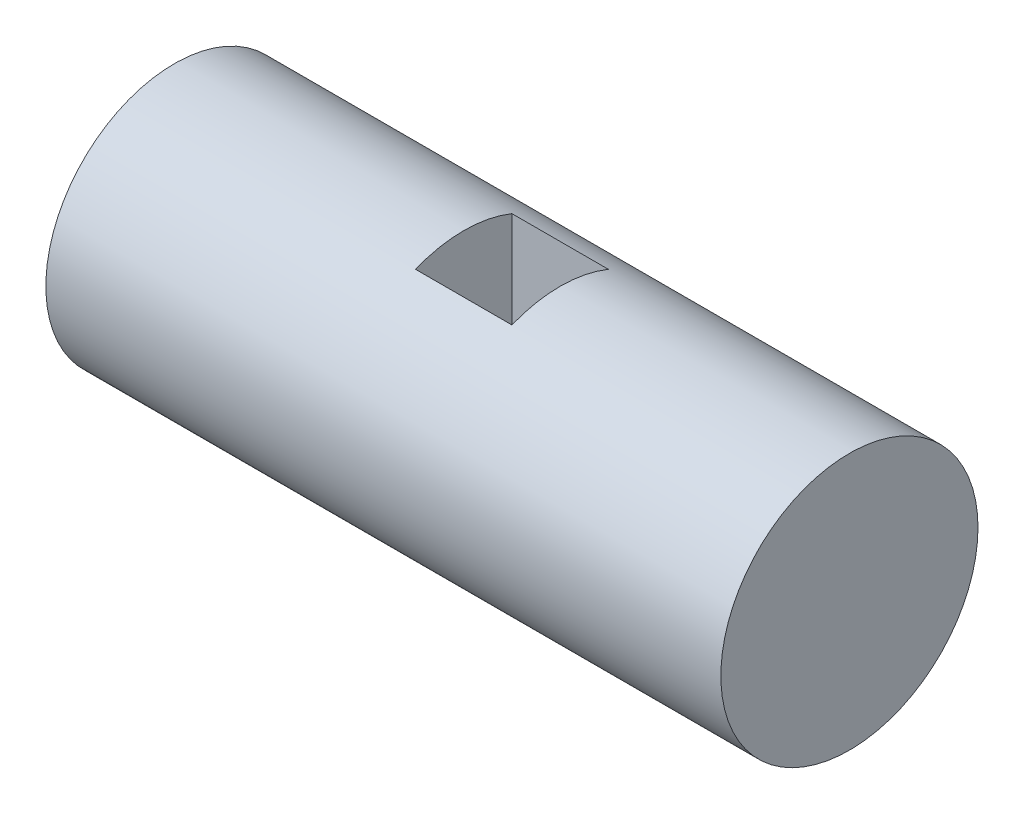
ISO-10303-21;
HEADER;
FILE_DESCRIPTION(('STEP AP214'),'2;1');
FILE_NAME('part.step','',(''),(''),'','','');
FILE_SCHEMA(('AUTOMOTIVE_DESIGN { 1 0 10303 214 1 1 1 1 }'));
ENDSEC;
DATA;
#1=APPLICATION_CONTEXT('core data for automotive mechanical design processes');
#2=APPLICATION_PROTOCOL_DEFINITION('international standard','automotive_design',2000,#1);
#3=PRODUCT_CONTEXT('',#1,'mechanical');
#4=PRODUCT('Part','Part','',(#3));
#5=PRODUCT_RELATED_PRODUCT_CATEGORY('part','',(#4));
#6=PRODUCT_DEFINITION_FORMATION('','',#4);
#7=PRODUCT_DEFINITION_CONTEXT('part definition',#1,'design');
#8=PRODUCT_DEFINITION('design','',#6,#7);
#9=PRODUCT_DEFINITION_SHAPE('','',#8);
#10=(LENGTH_UNIT() NAMED_UNIT(*) SI_UNIT(.MILLI.,.METRE.));
#11=(NAMED_UNIT(*) PLANE_ANGLE_UNIT() SI_UNIT($,.RADIAN.));
#12=(NAMED_UNIT(*) SI_UNIT($,.STERADIAN.) SOLID_ANGLE_UNIT());
#13=UNCERTAINTY_MEASURE_WITH_UNIT(LENGTH_MEASURE(1.E-05),#10,'distance_accuracy_value','');
#14=(GEOMETRIC_REPRESENTATION_CONTEXT(3) GLOBAL_UNCERTAINTY_ASSIGNED_CONTEXT((#13)) GLOBAL_UNIT_ASSIGNED_CONTEXT((#10,
#11,#12)) REPRESENTATION_CONTEXT('',''));
#15=CARTESIAN_POINT('',(0.,0.,0.));
#16=DIRECTION('',(0.,0.,1.));
#17=DIRECTION('',(1.,0.,0.));
#18=AXIS2_PLACEMENT_3D('',#15,#16,#17);
#19=CARTESIAN_POINT('',(105.,0.,0.));
#20=DIRECTION('',(-1.,0.,0.));
#21=DIRECTION('',(0.,0.,1.));
#22=AXIS2_PLACEMENT_3D('',#19,#20,#21);
#23=CYLINDRICAL_SURFACE('',#22,20.);
#24=CARTESIAN_POINT('',(60.,0.,0.));
#25=DIRECTION('',(-1.,0.,0.));
#26=DIRECTION('',(0.,0.,1.));
#27=AXIS2_PLACEMENT_3D('',#24,#25,#26);
#28=CIRCLE('',#27,20.);
#29=CARTESIAN_POINT('',(60.,18.5404962177392,-7.5));
#30=VERTEX_POINT('',#29);
#31=CARTESIAN_POINT('',(60.,18.5404962177392,7.5));
#32=VERTEX_POINT('',#31);
#33=EDGE_CURVE('E75',#30,#32,#28,.F.);
#34=ORIENTED_EDGE('',*,*,#33,.T.);
#35=DIRECTION('',(-1.,0.,0.));
#36=VECTOR('',#35,1.);
#37=CARTESIAN_POINT('',(105.,18.5404962177392,7.5));
#38=LINE('',#37,#36);
#39=CARTESIAN_POINT('',(45.,18.5404962177392,7.5));
#40=VERTEX_POINT('',#39);
#41=EDGE_CURVE('E78',#32,#40,#38,.T.);
#42=ORIENTED_EDGE('',*,*,#41,.T.);
#43=CARTESIAN_POINT('',(45.,0.,0.));
#44=DIRECTION('',(1.,0.,0.));
#45=DIRECTION('',(0.,0.,-1.));
#46=AXIS2_PLACEMENT_3D('',#43,#44,#45);
#47=CIRCLE('',#46,20.);
#48=CARTESIAN_POINT('',(45.,18.5404962177392,-7.5));
#49=VERTEX_POINT('',#48);
#50=EDGE_CURVE('E88',#40,#49,#47,.F.);
#51=ORIENTED_EDGE('',*,*,#50,.T.);
#52=DIRECTION('',(-1.,0.,0.));
#53=VECTOR('',#52,1.);
#54=CARTESIAN_POINT('',(105.,18.5404962177392,-7.5));
#55=LINE('',#54,#53);
#56=EDGE_CURVE('E99',#49,#30,#55,.F.);
#57=ORIENTED_EDGE('',*,*,#56,.T.);
#58=EDGE_LOOP('',(#34,#42,#51,#57));
#59=FACE_BOUND('',#58,.T.);
#60=CARTESIAN_POINT('',(105.,0.,0.));
#61=DIRECTION('',(1.,0.,0.));
#62=DIRECTION('',(0.,0.,-1.));
#63=AXIS2_PLACEMENT_3D('',#60,#61,#62);
#64=CIRCLE('',#63,20.);
#65=CARTESIAN_POINT('',(105.,0.,-20.));
#66=VERTEX_POINT('',#65);
#67=EDGE_CURVE('E11',#66,#66,#64,.T.);
#68=ORIENTED_EDGE('',*,*,#67,.F.);
#69=EDGE_LOOP('',(#68));
#70=FACE_BOUND('',#69,.T.);
#71=CARTESIAN_POINT('',(0.,0.,0.));
#72=DIRECTION('',(1.,0.,0.));
#73=DIRECTION('',(0.,0.,-1.));
#74=AXIS2_PLACEMENT_3D('',#71,#72,#73);
#75=CIRCLE('',#74,20.);
#76=CARTESIAN_POINT('',(0.,0.,-20.));
#77=VERTEX_POINT('',#76);
#78=EDGE_CURVE('E35',#77,#77,#75,.T.);
#79=ORIENTED_EDGE('',*,*,#78,.T.);
#80=EDGE_LOOP('',(#79));
#81=FACE_BOUND('',#80,.T.);
#82=CARTESIAN_POINT('',(60.,0.,0.));
#83=DIRECTION('',(1.,0.,0.));
#84=DIRECTION('',(0.,0.,-1.));
#85=AXIS2_PLACEMENT_3D('',#82,#83,#84);
#86=CIRCLE('',#85,20.);
#87=CARTESIAN_POINT('',(60.,-18.5404962177392,-7.5));
#88=VERTEX_POINT('',#87);
#89=CARTESIAN_POINT('',(60.,-18.5404962177392,7.5));
#90=VERTEX_POINT('',#89);
#91=EDGE_CURVE('E46',#88,#90,#86,.F.);
#92=ORIENTED_EDGE('',*,*,#91,.F.);
#93=DIRECTION('',(-1.,0.,0.));
#94=VECTOR('',#93,1.);
#95=CARTESIAN_POINT('',(105.,-18.5404962177392,-7.5));
#96=LINE('',#95,#94);
#97=CARTESIAN_POINT('',(45.,-18.5404962177392,-7.5));
#98=VERTEX_POINT('',#97);
#99=EDGE_CURVE('E82',#98,#88,#96,.F.);
#100=ORIENTED_EDGE('',*,*,#99,.F.);
#101=CARTESIAN_POINT('',(45.,0.,0.));
#102=DIRECTION('',(-1.,0.,0.));
#103=DIRECTION('',(0.,0.,1.));
#104=AXIS2_PLACEMENT_3D('',#101,#102,#103);
#105=CIRCLE('',#104,20.);
#106=CARTESIAN_POINT('',(45.,-18.5404962177392,7.5));
#107=VERTEX_POINT('',#106);
#108=EDGE_CURVE('E93',#107,#98,#105,.F.);
#109=ORIENTED_EDGE('',*,*,#108,.F.);
#110=DIRECTION('',(-1.,0.,0.));
#111=VECTOR('',#110,1.);
#112=CARTESIAN_POINT('',(105.,-18.5404962177392,7.5));
#113=LINE('',#112,#111);
#114=EDGE_CURVE('E91',#90,#107,#113,.T.);
#115=ORIENTED_EDGE('',*,*,#114,.F.);
#116=EDGE_LOOP('',(#92,#100,#109,#115));
#117=FACE_BOUND('',#116,.T.);
#118=ADVANCED_FACE('F32',(#59,#70,#81,#117),#23,.T.);
#119=CARTESIAN_POINT('',(105.,0.,0.));
#120=DIRECTION('',(1.,0.,0.));
#121=DIRECTION('',(0.,0.,-1.));
#122=AXIS2_PLACEMENT_3D('',#119,#120,#121);
#123=PLANE('',#122);
#124=ORIENTED_EDGE('',*,*,#67,.T.);
#125=EDGE_LOOP('',(#124));
#126=FACE_BOUND('',#125,.T.);
#127=ADVANCED_FACE('F114',(#126),#123,.T.);
#128=CARTESIAN_POINT('',(0.,0.,0.));
#129=DIRECTION('',(1.,0.,0.));
#130=DIRECTION('',(0.,0.,-1.));
#131=AXIS2_PLACEMENT_3D('',#128,#129,#130);
#132=PLANE('',#131);
#133=ORIENTED_EDGE('',*,*,#78,.F.);
#134=EDGE_LOOP('',(#133));
#135=FACE_BOUND('',#134,.T.);
#136=ADVANCED_FACE('F112',(#135),#132,.F.);
#137=CARTESIAN_POINT('',(60.,20.001,-7.5));
#138=DIRECTION('',(-1.,0.,0.));
#139=DIRECTION('',(0.,0.,1.));
#140=AXIS2_PLACEMENT_3D('',#137,#138,#139);
#141=PLANE('',#140);
#142=DIRECTION('',(0.,-1.,0.));
#143=VECTOR('',#142,1.);
#144=CARTESIAN_POINT('',(60.,20.001,-7.5));
#145=LINE('',#144,#143);
#146=EDGE_CURVE('E71',#30,#88,#145,.T.);
#147=ORIENTED_EDGE('',*,*,#146,.T.);
#148=ORIENTED_EDGE('',*,*,#91,.T.);
#149=DIRECTION('',(0.,-1.,0.));
#150=VECTOR('',#149,1.);
#151=CARTESIAN_POINT('',(60.,20.001,7.5));
#152=LINE('',#151,#150);
#153=EDGE_CURVE('E102',#32,#90,#152,.T.);
#154=ORIENTED_EDGE('',*,*,#153,.F.);
#155=ORIENTED_EDGE('',*,*,#33,.F.);
#156=EDGE_LOOP('',(#147,#148,#154,#155));
#157=FACE_BOUND('',#156,.T.);
#158=ADVANCED_FACE('F73',(#157),#141,.T.);
#159=CARTESIAN_POINT('',(45.,20.001,-7.5));
#160=DIRECTION('',(0.,0.,1.));
#161=DIRECTION('',(1.,0.,0.));
#162=AXIS2_PLACEMENT_3D('',#159,#160,#161);
#163=PLANE('',#162);
#164=DIRECTION('',(0.,-1.,0.));
#165=VECTOR('',#164,1.);
#166=CARTESIAN_POINT('',(45.,20.001,-7.5));
#167=LINE('',#166,#165);
#168=EDGE_CURVE('E79',#49,#98,#167,.T.);
#169=ORIENTED_EDGE('',*,*,#168,.T.);
#170=ORIENTED_EDGE('',*,*,#99,.T.);
#171=ORIENTED_EDGE('',*,*,#146,.F.);
#172=ORIENTED_EDGE('',*,*,#56,.F.);
#173=EDGE_LOOP('',(#169,#170,#171,#172));
#174=FACE_BOUND('',#173,.T.);
#175=ADVANCED_FACE('F83',(#174),#163,.T.);
#176=CARTESIAN_POINT('',(45.,20.001,-7.5));
#177=DIRECTION('',(1.,0.,0.));
#178=DIRECTION('',(0.,0.,-1.));
#179=AXIS2_PLACEMENT_3D('',#176,#177,#178);
#180=PLANE('',#179);
#181=DIRECTION('',(0.,-1.,0.));
#182=VECTOR('',#181,1.);
#183=CARTESIAN_POINT('',(45.,20.001,7.5));
#184=LINE('',#183,#182);
#185=EDGE_CURVE('E54',#40,#107,#184,.T.);
#186=ORIENTED_EDGE('',*,*,#185,.T.);
#187=ORIENTED_EDGE('',*,*,#108,.T.);
#188=ORIENTED_EDGE('',*,*,#168,.F.);
#189=ORIENTED_EDGE('',*,*,#50,.F.);
#190=EDGE_LOOP('',(#186,#187,#188,#189));
#191=FACE_BOUND('',#190,.T.);
#192=ADVANCED_FACE('F128',(#191),#180,.T.);
#193=CARTESIAN_POINT('',(45.,20.001,7.5));
#194=DIRECTION('',(0.,0.,-1.));
#195=DIRECTION('',(-1.,0.,0.));
#196=AXIS2_PLACEMENT_3D('',#193,#194,#195);
#197=PLANE('',#196);
#198=ORIENTED_EDGE('',*,*,#153,.T.);
#199=ORIENTED_EDGE('',*,*,#114,.T.);
#200=ORIENTED_EDGE('',*,*,#185,.F.);
#201=ORIENTED_EDGE('',*,*,#41,.F.);
#202=EDGE_LOOP('',(#198,#199,#200,#201));
#203=FACE_BOUND('',#202,.T.);
#204=ADVANCED_FACE('F129',(#203),#197,.T.);
#205=CLOSED_SHELL('',(#118,#127,#136,#158,#175,#192,#204));
#206=MANIFOLD_SOLID_BREP('B2',#205);
#207=ADVANCED_BREP_SHAPE_REPRESENTATION('',(#18,#206),#14);
#208=SHAPE_DEFINITION_REPRESENTATION(#9,#207);
ENDSEC;
END-ISO-10303-21;
